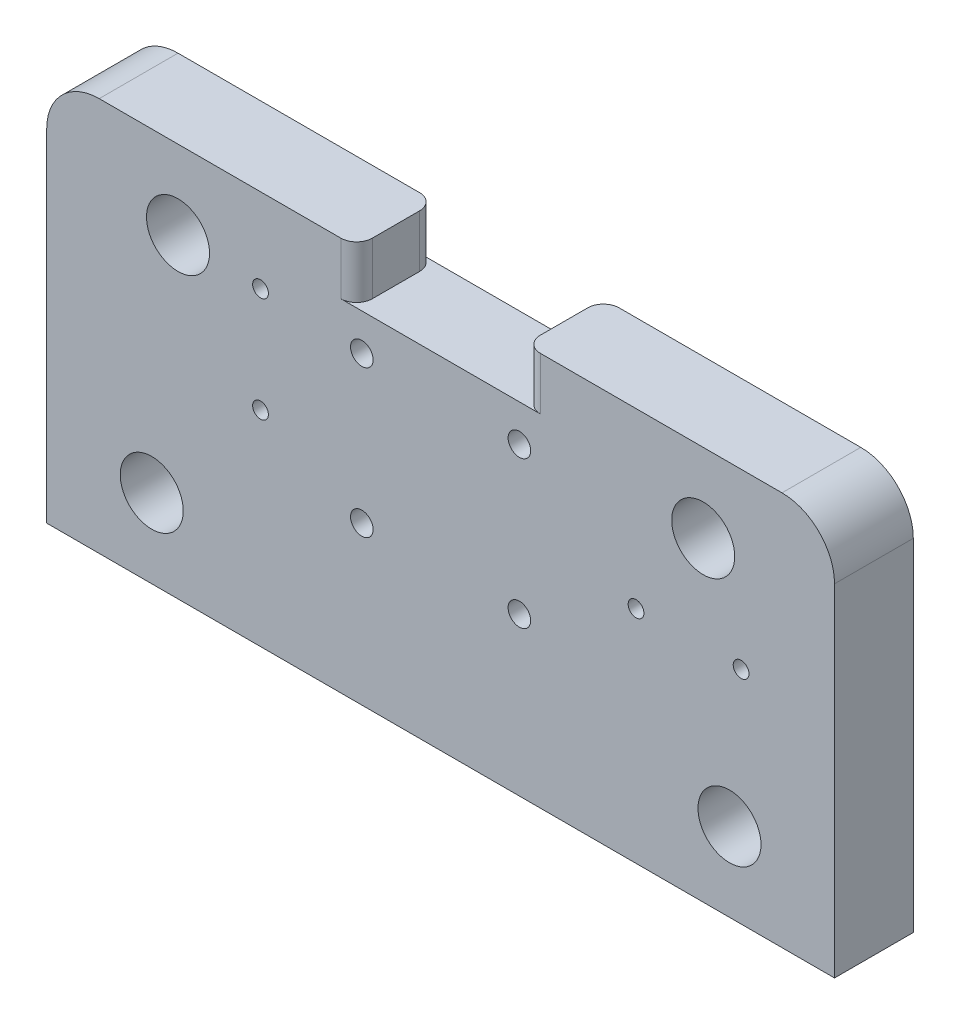
ISO-10303-21;
HEADER;
FILE_DESCRIPTION(('STEP AP214'),'2;1');
FILE_NAME('part.step','',(''),(''),'','','');
FILE_SCHEMA(('AUTOMOTIVE_DESIGN { 1 0 10303 214 1 1 1 1 }'));
ENDSEC;
DATA;
#1=APPLICATION_CONTEXT('core data for automotive mechanical design processes');
#2=APPLICATION_PROTOCOL_DEFINITION('international standard','automotive_design',2000,#1);
#3=PRODUCT_CONTEXT('',#1,'mechanical');
#4=PRODUCT('Part','Part','',(#3));
#5=PRODUCT_RELATED_PRODUCT_CATEGORY('part','',(#4));
#6=PRODUCT_DEFINITION_FORMATION('','',#4);
#7=PRODUCT_DEFINITION_CONTEXT('part definition',#1,'design');
#8=PRODUCT_DEFINITION('design','',#6,#7);
#9=PRODUCT_DEFINITION_SHAPE('','',#8);
#10=(LENGTH_UNIT() NAMED_UNIT(*) SI_UNIT(.MILLI.,.METRE.));
#11=(NAMED_UNIT(*) PLANE_ANGLE_UNIT() SI_UNIT($,.RADIAN.));
#12=(NAMED_UNIT(*) SI_UNIT($,.STERADIAN.) SOLID_ANGLE_UNIT());
#13=UNCERTAINTY_MEASURE_WITH_UNIT(LENGTH_MEASURE(1.E-05),#10,'distance_accuracy_value','');
#14=(GEOMETRIC_REPRESENTATION_CONTEXT(3) GLOBAL_UNCERTAINTY_ASSIGNED_CONTEXT((#13)) GLOBAL_UNIT_ASSIGNED_CONTEXT((#10,
#11,#12)) REPRESENTATION_CONTEXT('',''));
#15=CARTESIAN_POINT('',(0.,0.,0.));
#16=DIRECTION('',(0.,0.,1.));
#17=DIRECTION('',(1.,0.,0.));
#18=AXIS2_PLACEMENT_3D('',#15,#16,#17);
#19=CARTESIAN_POINT('',(-65.,27.5,15.));
#20=DIRECTION('',(0.,0.,-1.));
#21=DIRECTION('',(-1.,0.,0.));
#22=AXIS2_PLACEMENT_3D('',#19,#20,#21);
#23=PLANE('',#22);
#24=CARTESIAN_POINT('',(37.21,4.5,15.));
#25=DIRECTION('',(0.,0.,1.));
#26=DIRECTION('',(1.,0.,0.));
#27=AXIS2_PLACEMENT_3D('',#24,#25,#26);
#28=CIRCLE('',#27,1.5);
#29=CARTESIAN_POINT('',(38.71,4.5,15.));
#30=VERTEX_POINT('',#29);
#31=EDGE_CURVE('E679',#30,#30,#28,.T.);
#32=ORIENTED_EDGE('',*,*,#31,.F.);
#33=EDGE_LOOP('',(#32));
#34=FACE_BOUND('',#33,.T.);
#35=CARTESIAN_POINT('',(57.21,4.5,15.));
#36=DIRECTION('',(0.,0.,1.));
#37=DIRECTION('',(1.,0.,0.));
#38=AXIS2_PLACEMENT_3D('',#35,#36,#37);
#39=CIRCLE('',#38,1.5);
#40=CARTESIAN_POINT('',(58.71,4.5,15.));
#41=VERTEX_POINT('',#40);
#42=EDGE_CURVE('E676',#41,#41,#39,.T.);
#43=ORIENTED_EDGE('',*,*,#42,.F.);
#44=EDGE_LOOP('',(#43));
#45=FACE_BOUND('',#44,.T.);
#46=CARTESIAN_POINT('',(-34.29,1.50000000000002,15.));
#47=DIRECTION('',(0.,0.,1.));
#48=DIRECTION('',(1.,0.,0.));
#49=AXIS2_PLACEMENT_3D('',#46,#47,#48);
#50=CIRCLE('',#49,1.5);
#51=CARTESIAN_POINT('',(-32.79,1.50000000000002,15.));
#52=VERTEX_POINT('',#51);
#53=EDGE_CURVE('E668',#52,#52,#50,.T.);
#54=ORIENTED_EDGE('',*,*,#53,.F.);
#55=EDGE_LOOP('',(#54));
#56=FACE_BOUND('',#55,.T.);
#57=CARTESIAN_POINT('',(-34.29,21.5,15.));
#58=DIRECTION('',(0.,0.,1.));
#59=DIRECTION('',(1.,0.,0.));
#60=AXIS2_PLACEMENT_3D('',#57,#58,#59);
#61=CIRCLE('',#60,1.5);
#62=CARTESIAN_POINT('',(-32.79,21.5,15.));
#63=VERTEX_POINT('',#62);
#64=EDGE_CURVE('E661',#63,#63,#61,.T.);
#65=ORIENTED_EDGE('',*,*,#64,.F.);
#66=EDGE_LOOP('',(#65));
#67=FACE_BOUND('',#66,.T.);
#68=CARTESIAN_POINT('',(50.,22.5,15.));
#69=DIRECTION('',(0.,0.,1.));
#70=DIRECTION('',(1.,0.,0.));
#71=AXIS2_PLACEMENT_3D('',#68,#69,#70);
#72=CIRCLE('',#71,6.);
#73=CARTESIAN_POINT('',(56.,22.5,15.));
#74=VERTEX_POINT('',#73);
#75=EDGE_CURVE('E650',#74,#74,#72,.T.);
#76=ORIENTED_EDGE('',*,*,#75,.F.);
#77=EDGE_LOOP('',(#76));
#78=FACE_BOUND('',#77,.T.);
#79=CARTESIAN_POINT('',(-55.,-22.5,15.));
#80=DIRECTION('',(0.,0.,1.));
#81=DIRECTION('',(1.,0.,0.));
#82=AXIS2_PLACEMENT_3D('',#79,#80,#81);
#83=CIRCLE('',#82,5.99999999999999);
#84=CARTESIAN_POINT('',(-49.,-22.5,15.));
#85=VERTEX_POINT('',#84);
#86=EDGE_CURVE('E643',#85,#85,#83,.T.);
#87=ORIENTED_EDGE('',*,*,#86,.F.);
#88=EDGE_LOOP('',(#87));
#89=FACE_BOUND('',#88,.T.);
#90=CARTESIAN_POINT('',(55.,-22.5,15.));
#91=DIRECTION('',(0.,0.,1.));
#92=DIRECTION('',(1.,0.,0.));
#93=AXIS2_PLACEMENT_3D('',#90,#91,#92);
#94=CIRCLE('',#93,5.99999999999999);
#95=CARTESIAN_POINT('',(61.,-22.5,15.));
#96=VERTEX_POINT('',#95);
#97=EDGE_CURVE('E655',#96,#96,#94,.T.);
#98=ORIENTED_EDGE('',*,*,#97,.F.);
#99=EDGE_LOOP('',(#98));
#100=FACE_BOUND('',#99,.T.);
#101=CARTESIAN_POINT('',(-50.,22.5,15.));
#102=DIRECTION('',(0.,0.,1.));
#103=DIRECTION('',(1.,0.,0.));
#104=AXIS2_PLACEMENT_3D('',#101,#102,#103);
#105=CIRCLE('',#104,6.);
#106=CARTESIAN_POINT('',(-44.,22.5,15.));
#107=VERTEX_POINT('',#106);
#108=EDGE_CURVE('E637',#107,#107,#105,.T.);
#109=ORIENTED_EDGE('',*,*,#108,.F.);
#110=EDGE_LOOP('',(#109));
#111=FACE_BOUND('',#110,.T.);
#112=DIRECTION('',(1.,0.,0.));
#113=VECTOR('',#112,1.);
#114=CARTESIAN_POINT('',(16.,37.5,15.));
#115=LINE('',#114,#113);
#116=CARTESIAN_POINT('',(18.9999999999999,37.5,15.));
#117=VERTEX_POINT('',#116);
#118=CARTESIAN_POINT('',(65.,37.5,15.));
#119=VERTEX_POINT('',#118);
#120=EDGE_CURVE('E304',#117,#119,#115,.T.);
#121=ORIENTED_EDGE('',*,*,#120,.F.);
#122=DIRECTION('',(0.,-1.,0.));
#123=VECTOR('',#122,1.);
#124=CARTESIAN_POINT('',(18.9999999999999,27.5,15.));
#125=LINE('',#124,#123);
#126=CARTESIAN_POINT('',(18.9999999999999,27.5,15.));
#127=VERTEX_POINT('',#126);
#128=EDGE_CURVE('E366',#117,#127,#125,.T.);
#129=ORIENTED_EDGE('',*,*,#128,.T.);
#130=DIRECTION('',(1.,0.,0.));
#131=VECTOR('',#130,1.);
#132=CARTESIAN_POINT('',(-16.,27.5,15.));
#133=LINE('',#132,#131);
#134=CARTESIAN_POINT('',(-19.,27.5,15.));
#135=VERTEX_POINT('',#134);
#136=EDGE_CURVE('E290',#135,#127,#133,.T.);
#137=ORIENTED_EDGE('',*,*,#136,.F.);
#138=DIRECTION('',(0.,-1.,0.));
#139=VECTOR('',#138,1.);
#140=CARTESIAN_POINT('',(-19.,37.5,15.));
#141=LINE('',#140,#139);
#142=CARTESIAN_POINT('',(-19.,37.5,15.));
#143=VERTEX_POINT('',#142);
#144=EDGE_CURVE('E289',#135,#143,#141,.F.);
#145=ORIENTED_EDGE('',*,*,#144,.T.);
#146=DIRECTION('',(1.,0.,0.));
#147=VECTOR('',#146,1.);
#148=CARTESIAN_POINT('',(-65.,37.5,15.));
#149=LINE('',#148,#147);
#150=CARTESIAN_POINT('',(-65.,37.5,15.));
#151=VERTEX_POINT('',#150);
#152=EDGE_CURVE('E273',#151,#143,#149,.T.);
#153=ORIENTED_EDGE('',*,*,#152,.F.);
#154=CARTESIAN_POINT('',(-65.,27.5,15.));
#155=DIRECTION('',(0.,0.,-1.));
#156=DIRECTION('',(-1.,0.,0.));
#157=AXIS2_PLACEMENT_3D('',#154,#155,#156);
#158=CIRCLE('',#157,10.);
#159=CARTESIAN_POINT('',(-75.,27.5,15.));
#160=VERTEX_POINT('',#159);
#161=EDGE_CURVE('E288',#160,#151,#158,.T.);
#162=ORIENTED_EDGE('',*,*,#161,.F.);
#163=DIRECTION('',(0.,-1.,0.));
#164=VECTOR('',#163,1.);
#165=CARTESIAN_POINT('',(-75.,27.5,15.));
#166=LINE('',#165,#164);
#167=CARTESIAN_POINT('',(-75.,-37.5,15.));
#168=VERTEX_POINT('',#167);
#169=EDGE_CURVE('E282',#160,#168,#166,.T.);
#170=ORIENTED_EDGE('',*,*,#169,.T.);
#171=DIRECTION('',(1.,0.,0.));
#172=VECTOR('',#171,1.);
#173=CARTESIAN_POINT('',(-75.,-37.5,15.));
#174=LINE('',#173,#172);
#175=CARTESIAN_POINT('',(75.,-37.5,15.));
#176=VERTEX_POINT('',#175);
#177=EDGE_CURVE('E312',#168,#176,#174,.T.);
#178=ORIENTED_EDGE('',*,*,#177,.T.);
#179=DIRECTION('',(0.,-1.,0.));
#180=VECTOR('',#179,1.);
#181=CARTESIAN_POINT('',(75.,27.5,15.));
#182=LINE('',#181,#180);
#183=CARTESIAN_POINT('',(75.,27.5,15.));
#184=VERTEX_POINT('',#183);
#185=EDGE_CURVE('E309',#184,#176,#182,.T.);
#186=ORIENTED_EDGE('',*,*,#185,.F.);
#187=CARTESIAN_POINT('',(65.,27.5,15.));
#188=DIRECTION('',(0.,0.,1.));
#189=DIRECTION('',(1.,0.,0.));
#190=AXIS2_PLACEMENT_3D('',#187,#188,#189);
#191=CIRCLE('',#190,10.);
#192=EDGE_CURVE('E306',#184,#119,#191,.T.);
#193=ORIENTED_EDGE('',*,*,#192,.T.);
#194=EDGE_LOOP('',(#121,#129,#137,#145,#153,#162,#170,#178,#186,#193));
#195=FACE_BOUND('',#194,.T.);
#196=CARTESIAN_POINT('',(-15.,20.5,15.));
#197=DIRECTION('',(0.,0.,1.));
#198=DIRECTION('',(1.,0.,0.));
#199=AXIS2_PLACEMENT_3D('',#196,#197,#198);
#200=CIRCLE('',#199,2.15);
#201=CARTESIAN_POINT('',(-12.85,20.5,15.));
#202=VERTEX_POINT('',#201);
#203=EDGE_CURVE('E317',#202,#202,#200,.T.);
#204=ORIENTED_EDGE('',*,*,#203,.F.);
#205=EDGE_LOOP('',(#204));
#206=FACE_BOUND('',#205,.T.);
#207=CARTESIAN_POINT('',(15.,20.5,15.));
#208=DIRECTION('',(0.,0.,1.));
#209=DIRECTION('',(1.,0.,0.));
#210=AXIS2_PLACEMENT_3D('',#207,#208,#209);
#211=CIRCLE('',#210,2.15);
#212=CARTESIAN_POINT('',(17.15,20.5,15.));
#213=VERTEX_POINT('',#212);
#214=EDGE_CURVE('E606',#213,#213,#211,.T.);
#215=ORIENTED_EDGE('',*,*,#214,.F.);
#216=EDGE_LOOP('',(#215));
#217=FACE_BOUND('',#216,.T.);
#218=CARTESIAN_POINT('',(15.,-7.5,15.));
#219=DIRECTION('',(0.,0.,1.));
#220=DIRECTION('',(1.,0.,0.));
#221=AXIS2_PLACEMENT_3D('',#218,#219,#220);
#222=CIRCLE('',#221,2.15);
#223=CARTESIAN_POINT('',(17.15,-7.5,15.));
#224=VERTEX_POINT('',#223);
#225=EDGE_CURVE('E610',#224,#224,#222,.T.);
#226=ORIENTED_EDGE('',*,*,#225,.F.);
#227=EDGE_LOOP('',(#226));
#228=FACE_BOUND('',#227,.T.);
#229=CARTESIAN_POINT('',(-15.,-7.5,15.));
#230=DIRECTION('',(0.,0.,1.));
#231=DIRECTION('',(1.,0.,0.));
#232=AXIS2_PLACEMENT_3D('',#229,#230,#231);
#233=CIRCLE('',#232,2.15);
#234=CARTESIAN_POINT('',(-12.85,-7.5,15.));
#235=VERTEX_POINT('',#234);
#236=EDGE_CURVE('E629',#235,#235,#233,.T.);
#237=ORIENTED_EDGE('',*,*,#236,.F.);
#238=EDGE_LOOP('',(#237));
#239=FACE_BOUND('',#238,.T.);
#240=ADVANCED_FACE('F168',(#34,#45,#56,#67,#78,#89,#100,#111,#195,#206,#217,#228,#239),#23,.F.);
#241=CARTESIAN_POINT('',(-65.,27.5,0.));
#242=DIRECTION('',(0.,0.,-1.));
#243=DIRECTION('',(-1.,0.,0.));
#244=AXIS2_PLACEMENT_3D('',#241,#242,#243);
#245=PLANE('',#244);
#246=CARTESIAN_POINT('',(37.21,4.5,0.));
#247=DIRECTION('',(0.,0.,1.));
#248=DIRECTION('',(1.,0.,0.));
#249=AXIS2_PLACEMENT_3D('',#246,#247,#248);
#250=CIRCLE('',#249,1.5);
#251=CARTESIAN_POINT('',(38.71,4.5,0.));
#252=VERTEX_POINT('',#251);
#253=EDGE_CURVE('E665',#252,#252,#250,.T.);
#254=ORIENTED_EDGE('',*,*,#253,.T.);
#255=EDGE_LOOP('',(#254));
#256=FACE_BOUND('',#255,.T.);
#257=CARTESIAN_POINT('',(57.21,4.5,0.));
#258=DIRECTION('',(0.,0.,1.));
#259=DIRECTION('',(1.,0.,0.));
#260=AXIS2_PLACEMENT_3D('',#257,#258,#259);
#261=CIRCLE('',#260,1.5);
#262=CARTESIAN_POINT('',(58.71,4.5,0.));
#263=VERTEX_POINT('',#262);
#264=EDGE_CURVE('E673',#263,#263,#261,.T.);
#265=ORIENTED_EDGE('',*,*,#264,.T.);
#266=EDGE_LOOP('',(#265));
#267=FACE_BOUND('',#266,.T.);
#268=CARTESIAN_POINT('',(-34.29,1.50000000000002,0.));
#269=DIRECTION('',(0.,0.,1.));
#270=DIRECTION('',(1.,0.,0.));
#271=AXIS2_PLACEMENT_3D('',#268,#269,#270);
#272=CIRCLE('',#271,1.5);
#273=CARTESIAN_POINT('',(-32.79,1.50000000000002,0.));
#274=VERTEX_POINT('',#273);
#275=EDGE_CURVE('E658',#274,#274,#272,.T.);
#276=ORIENTED_EDGE('',*,*,#275,.T.);
#277=EDGE_LOOP('',(#276));
#278=FACE_BOUND('',#277,.T.);
#279=CARTESIAN_POINT('',(-34.29,21.5,0.));
#280=DIRECTION('',(0.,0.,1.));
#281=DIRECTION('',(1.,0.,0.));
#282=AXIS2_PLACEMENT_3D('',#279,#280,#281);
#283=CIRCLE('',#282,1.5);
#284=CARTESIAN_POINT('',(-32.79,21.5,0.));
#285=VERTEX_POINT('',#284);
#286=EDGE_CURVE('E664',#285,#285,#283,.T.);
#287=ORIENTED_EDGE('',*,*,#286,.T.);
#288=EDGE_LOOP('',(#287));
#289=FACE_BOUND('',#288,.T.);
#290=CARTESIAN_POINT('',(50.,22.5,0.));
#291=DIRECTION('',(0.,0.,1.));
#292=DIRECTION('',(1.,0.,0.));
#293=AXIS2_PLACEMENT_3D('',#290,#291,#292);
#294=CIRCLE('',#293,6.);
#295=CARTESIAN_POINT('',(56.,22.5,0.));
#296=VERTEX_POINT('',#295);
#297=EDGE_CURVE('E640',#296,#296,#294,.T.);
#298=ORIENTED_EDGE('',*,*,#297,.T.);
#299=EDGE_LOOP('',(#298));
#300=FACE_BOUND('',#299,.T.);
#301=CARTESIAN_POINT('',(-55.,-22.5,0.));
#302=DIRECTION('',(0.,0.,1.));
#303=DIRECTION('',(1.,0.,0.));
#304=AXIS2_PLACEMENT_3D('',#301,#302,#303);
#305=CIRCLE('',#304,5.99999999999999);
#306=CARTESIAN_POINT('',(-49.,-22.5,0.));
#307=VERTEX_POINT('',#306);
#308=EDGE_CURVE('E646',#307,#307,#305,.T.);
#309=ORIENTED_EDGE('',*,*,#308,.T.);
#310=EDGE_LOOP('',(#309));
#311=FACE_BOUND('',#310,.T.);
#312=CARTESIAN_POINT('',(55.,-22.5,0.));
#313=DIRECTION('',(0.,0.,1.));
#314=DIRECTION('',(1.,0.,0.));
#315=AXIS2_PLACEMENT_3D('',#312,#313,#314);
#316=CIRCLE('',#315,5.99999999999999);
#317=CARTESIAN_POINT('',(61.,-22.5,0.));
#318=VERTEX_POINT('',#317);
#319=EDGE_CURVE('E647',#318,#318,#316,.T.);
#320=ORIENTED_EDGE('',*,*,#319,.T.);
#321=EDGE_LOOP('',(#320));
#322=FACE_BOUND('',#321,.T.);
#323=CARTESIAN_POINT('',(-50.,22.5,0.));
#324=DIRECTION('',(0.,0.,1.));
#325=DIRECTION('',(1.,0.,0.));
#326=AXIS2_PLACEMENT_3D('',#323,#324,#325);
#327=CIRCLE('',#326,6.);
#328=CARTESIAN_POINT('',(-44.,22.5,0.));
#329=VERTEX_POINT('',#328);
#330=EDGE_CURVE('E634',#329,#329,#327,.T.);
#331=ORIENTED_EDGE('',*,*,#330,.T.);
#332=EDGE_LOOP('',(#331));
#333=FACE_BOUND('',#332,.T.);
#334=CARTESIAN_POINT('',(15.,-7.5,0.));
#335=DIRECTION('',(0.,0.,1.));
#336=DIRECTION('',(1.,0.,0.));
#337=AXIS2_PLACEMENT_3D('',#334,#335,#336);
#338=CIRCLE('',#337,2.15);
#339=CARTESIAN_POINT('',(17.15,-7.5,0.));
#340=VERTEX_POINT('',#339);
#341=EDGE_CURVE('E614',#340,#340,#338,.T.);
#342=ORIENTED_EDGE('',*,*,#341,.T.);
#343=EDGE_LOOP('',(#342));
#344=FACE_BOUND('',#343,.T.);
#345=CARTESIAN_POINT('',(-15.,20.5,0.));
#346=DIRECTION('',(0.,0.,1.));
#347=DIRECTION('',(1.,0.,0.));
#348=AXIS2_PLACEMENT_3D('',#345,#346,#347);
#349=CIRCLE('',#348,2.15);
#350=CARTESIAN_POINT('',(-12.85,20.5,0.));
#351=VERTEX_POINT('',#350);
#352=EDGE_CURVE('E300',#351,#351,#349,.T.);
#353=ORIENTED_EDGE('',*,*,#352,.T.);
#354=EDGE_LOOP('',(#353));
#355=FACE_BOUND('',#354,.T.);
#356=DIRECTION('',(1.,0.,0.));
#357=VECTOR('',#356,1.);
#358=CARTESIAN_POINT('',(-16.,27.5,0.));
#359=LINE('',#358,#357);
#360=CARTESIAN_POINT('',(-19.,27.5,0.));
#361=VERTEX_POINT('',#360);
#362=CARTESIAN_POINT('',(19.,27.5,0.));
#363=VERTEX_POINT('',#362);
#364=EDGE_CURVE('E319',#361,#363,#359,.T.);
#365=ORIENTED_EDGE('',*,*,#364,.T.);
#366=DIRECTION('',(0.,-1.,0.));
#367=VECTOR('',#366,1.);
#368=CARTESIAN_POINT('',(19.,37.5,0.));
#369=LINE('',#368,#367);
#370=CARTESIAN_POINT('',(19.,37.5,0.));
#371=VERTEX_POINT('',#370);
#372=EDGE_CURVE('E359',#363,#371,#369,.F.);
#373=ORIENTED_EDGE('',*,*,#372,.T.);
#374=DIRECTION('',(1.,0.,0.));
#375=VECTOR('',#374,1.);
#376=CARTESIAN_POINT('',(16.,37.5,0.));
#377=LINE('',#376,#375);
#378=CARTESIAN_POINT('',(65.,37.5,0.));
#379=VERTEX_POINT('',#378);
#380=EDGE_CURVE('E321',#371,#379,#377,.T.);
#381=ORIENTED_EDGE('',*,*,#380,.T.);
#382=CARTESIAN_POINT('',(65.,27.5,0.));
#383=DIRECTION('',(0.,0.,1.));
#384=DIRECTION('',(1.,0.,0.));
#385=AXIS2_PLACEMENT_3D('',#382,#383,#384);
#386=CIRCLE('',#385,10.);
#387=CARTESIAN_POINT('',(75.,27.5,0.));
#388=VERTEX_POINT('',#387);
#389=EDGE_CURVE('E323',#388,#379,#386,.T.);
#390=ORIENTED_EDGE('',*,*,#389,.F.);
#391=DIRECTION('',(0.,-1.,0.));
#392=VECTOR('',#391,1.);
#393=CARTESIAN_POINT('',(75.,27.5,0.));
#394=LINE('',#393,#392);
#395=CARTESIAN_POINT('',(75.,-37.5,0.));
#396=VERTEX_POINT('',#395);
#397=EDGE_CURVE('E326',#388,#396,#394,.T.);
#398=ORIENTED_EDGE('',*,*,#397,.T.);
#399=DIRECTION('',(1.,0.,0.));
#400=VECTOR('',#399,1.);
#401=CARTESIAN_POINT('',(-75.,-37.5,0.));
#402=LINE('',#401,#400);
#403=CARTESIAN_POINT('',(-75.,-37.5,0.));
#404=VERTEX_POINT('',#403);
#405=EDGE_CURVE('E297',#404,#396,#402,.T.);
#406=ORIENTED_EDGE('',*,*,#405,.F.);
#407=DIRECTION('',(0.,-1.,0.));
#408=VECTOR('',#407,1.);
#409=CARTESIAN_POINT('',(-75.,27.5,0.));
#410=LINE('',#409,#408);
#411=CARTESIAN_POINT('',(-75.,27.5,0.));
#412=VERTEX_POINT('',#411);
#413=EDGE_CURVE('E295',#412,#404,#410,.T.);
#414=ORIENTED_EDGE('',*,*,#413,.F.);
#415=CARTESIAN_POINT('',(-65.,27.5,0.));
#416=DIRECTION('',(0.,0.,-1.));
#417=DIRECTION('',(-1.,0.,0.));
#418=AXIS2_PLACEMENT_3D('',#415,#416,#417);
#419=CIRCLE('',#418,10.);
#420=CARTESIAN_POINT('',(-65.,37.5,0.));
#421=VERTEX_POINT('',#420);
#422=EDGE_CURVE('E315',#412,#421,#419,.T.);
#423=ORIENTED_EDGE('',*,*,#422,.T.);
#424=DIRECTION('',(1.,0.,0.));
#425=VECTOR('',#424,1.);
#426=CARTESIAN_POINT('',(-65.,37.5,0.));
#427=LINE('',#426,#425);
#428=CARTESIAN_POINT('',(-19.,37.5,0.));
#429=VERTEX_POINT('',#428);
#430=EDGE_CURVE('E276',#421,#429,#427,.T.);
#431=ORIENTED_EDGE('',*,*,#430,.T.);
#432=DIRECTION('',(0.,-1.,0.));
#433=VECTOR('',#432,1.);
#434=CARTESIAN_POINT('',(-19.,27.5,0.));
#435=LINE('',#434,#433);
#436=EDGE_CURVE('E356',#429,#361,#435,.T.);
#437=ORIENTED_EDGE('',*,*,#436,.T.);
#438=EDGE_LOOP('',(#365,#373,#381,#390,#398,#406,#414,#423,#431,#437));
#439=FACE_BOUND('',#438,.T.);
#440=CARTESIAN_POINT('',(15.,20.5,0.));
#441=DIRECTION('',(0.,0.,1.));
#442=DIRECTION('',(1.,0.,0.));
#443=AXIS2_PLACEMENT_3D('',#440,#441,#442);
#444=CIRCLE('',#443,2.15);
#445=CARTESIAN_POINT('',(17.15,20.5,0.));
#446=VERTEX_POINT('',#445);
#447=EDGE_CURVE('E609',#446,#446,#444,.T.);
#448=ORIENTED_EDGE('',*,*,#447,.T.);
#449=EDGE_LOOP('',(#448));
#450=FACE_BOUND('',#449,.T.);
#451=CARTESIAN_POINT('',(-15.,-7.5,0.));
#452=DIRECTION('',(0.,0.,1.));
#453=DIRECTION('',(1.,0.,0.));
#454=AXIS2_PLACEMENT_3D('',#451,#452,#453);
#455=CIRCLE('',#454,2.15);
#456=CARTESIAN_POINT('',(-12.85,-7.5,0.));
#457=VERTEX_POINT('',#456);
#458=EDGE_CURVE('E630',#457,#457,#455,.T.);
#459=ORIENTED_EDGE('',*,*,#458,.T.);
#460=EDGE_LOOP('',(#459));
#461=FACE_BOUND('',#460,.T.);
#462=ADVANCED_FACE('F412',(#256,#267,#278,#289,#300,#311,#322,#333,#344,#355,#439,#450,#461),
#245,.T.);
#463=CARTESIAN_POINT('',(-65.,27.5,15.));
#464=DIRECTION('',(0.,0.,-1.));
#465=DIRECTION('',(-1.,0.,0.));
#466=AXIS2_PLACEMENT_3D('',#463,#464,#465);
#467=CYLINDRICAL_SURFACE('',#466,10.);
#468=ORIENTED_EDGE('',*,*,#422,.F.);
#469=DIRECTION('',(0.,0.,-1.));
#470=VECTOR('',#469,1.);
#471=CARTESIAN_POINT('',(-75.,27.5,15.));
#472=LINE('',#471,#470);
#473=EDGE_CURVE('E293',#160,#412,#472,.T.);
#474=ORIENTED_EDGE('',*,*,#473,.F.);
#475=ORIENTED_EDGE('',*,*,#161,.T.);
#476=DIRECTION('',(0.,0.,-1.));
#477=VECTOR('',#476,1.);
#478=CARTESIAN_POINT('',(-65.,37.5,15.));
#479=LINE('',#478,#477);
#480=EDGE_CURVE('E269',#151,#421,#479,.T.);
#481=ORIENTED_EDGE('',*,*,#480,.T.);
#482=EDGE_LOOP('',(#468,#474,#475,#481));
#483=FACE_BOUND('',#482,.T.);
#484=ADVANCED_FACE('F292',(#483),#467,.T.);
#485=CARTESIAN_POINT('',(-75.,27.5,15.));
#486=DIRECTION('',(1.,0.,0.));
#487=DIRECTION('',(0.,1.,0.));
#488=AXIS2_PLACEMENT_3D('',#485,#486,#487);
#489=PLANE('',#488);
#490=ORIENTED_EDGE('',*,*,#413,.T.);
#491=DIRECTION('',(0.,0.,-1.));
#492=VECTOR('',#491,1.);
#493=CARTESIAN_POINT('',(-75.,-37.5,15.));
#494=LINE('',#493,#492);
#495=EDGE_CURVE('E333',#168,#404,#494,.T.);
#496=ORIENTED_EDGE('',*,*,#495,.F.);
#497=ORIENTED_EDGE('',*,*,#169,.F.);
#498=ORIENTED_EDGE('',*,*,#473,.T.);
#499=EDGE_LOOP('',(#490,#496,#497,#498));
#500=FACE_BOUND('',#499,.T.);
#501=ADVANCED_FACE('F418',(#500),#489,.F.);
#502=CARTESIAN_POINT('',(-75.,-37.5,15.));
#503=DIRECTION('',(0.,1.,0.));
#504=DIRECTION('',(0.,0.,1.));
#505=AXIS2_PLACEMENT_3D('',#502,#503,#504);
#506=PLANE('',#505);
#507=ORIENTED_EDGE('',*,*,#405,.T.);
#508=DIRECTION('',(0.,0.,-1.));
#509=VECTOR('',#508,1.);
#510=CARTESIAN_POINT('',(75.,-37.5,15.));
#511=LINE('',#510,#509);
#512=EDGE_CURVE('E336',#176,#396,#511,.T.);
#513=ORIENTED_EDGE('',*,*,#512,.F.);
#514=ORIENTED_EDGE('',*,*,#177,.F.);
#515=ORIENTED_EDGE('',*,*,#495,.T.);
#516=EDGE_LOOP('',(#507,#513,#514,#515));
#517=FACE_BOUND('',#516,.T.);
#518=ADVANCED_FACE('F421',(#517),#506,.F.);
#519=CARTESIAN_POINT('',(75.,27.5,15.));
#520=DIRECTION('',(1.,0.,0.));
#521=DIRECTION('',(0.,1.,0.));
#522=AXIS2_PLACEMENT_3D('',#519,#520,#521);
#523=PLANE('',#522);
#524=ORIENTED_EDGE('',*,*,#397,.F.);
#525=DIRECTION('',(0.,0.,-1.));
#526=VECTOR('',#525,1.);
#527=CARTESIAN_POINT('',(75.,27.5,15.));
#528=LINE('',#527,#526);
#529=EDGE_CURVE('E338',#184,#388,#528,.T.);
#530=ORIENTED_EDGE('',*,*,#529,.F.);
#531=ORIENTED_EDGE('',*,*,#185,.T.);
#532=ORIENTED_EDGE('',*,*,#512,.T.);
#533=EDGE_LOOP('',(#524,#530,#531,#532));
#534=FACE_BOUND('',#533,.T.);
#535=ADVANCED_FACE('F425',(#534),#523,.T.);
#536=CARTESIAN_POINT('',(65.,27.5,15.));
#537=DIRECTION('',(0.,0.,-1.));
#538=DIRECTION('',(-1.,0.,0.));
#539=AXIS2_PLACEMENT_3D('',#536,#537,#538);
#540=CYLINDRICAL_SURFACE('',#539,10.);
#541=ORIENTED_EDGE('',*,*,#389,.T.);
#542=DIRECTION('',(0.,0.,-1.));
#543=VECTOR('',#542,1.);
#544=CARTESIAN_POINT('',(65.,37.5,15.));
#545=LINE('',#544,#543);
#546=EDGE_CURVE('E340',#119,#379,#545,.T.);
#547=ORIENTED_EDGE('',*,*,#546,.F.);
#548=ORIENTED_EDGE('',*,*,#192,.F.);
#549=ORIENTED_EDGE('',*,*,#529,.T.);
#550=EDGE_LOOP('',(#541,#547,#548,#549));
#551=FACE_BOUND('',#550,.T.);
#552=ADVANCED_FACE('F400',(#551),#540,.T.);
#553=CARTESIAN_POINT('',(16.,37.5,15.));
#554=DIRECTION('',(0.,1.,0.));
#555=DIRECTION('',(-1.,0.,0.));
#556=AXIS2_PLACEMENT_3D('',#553,#554,#555);
#557=PLANE('',#556);
#558=ORIENTED_EDGE('',*,*,#380,.F.);
#559=CARTESIAN_POINT('',(19.,37.5,3.));
#560=DIRECTION('',(0.,1.,0.));
#561=DIRECTION('',(-1.,0.,0.));
#562=AXIS2_PLACEMENT_3D('',#559,#560,#561);
#563=CIRCLE('',#562,3.);
#564=CARTESIAN_POINT('',(16.,37.5,3.));
#565=VERTEX_POINT('',#564);
#566=EDGE_CURVE('E363',#371,#565,#563,.T.);
#567=ORIENTED_EDGE('',*,*,#566,.T.);
#568=DIRECTION('',(0.,0.,-1.));
#569=VECTOR('',#568,1.);
#570=CARTESIAN_POINT('',(16.,37.5,15.));
#571=LINE('',#570,#569);
#572=CARTESIAN_POINT('',(16.,37.5,12.));
#573=VERTEX_POINT('',#572);
#574=EDGE_CURVE('E343',#573,#565,#571,.T.);
#575=ORIENTED_EDGE('',*,*,#574,.F.);
#576=CARTESIAN_POINT('',(18.9999999999999,37.5,12.));
#577=DIRECTION('',(0.,1.,0.));
#578=DIRECTION('',(-1.,0.,0.));
#579=AXIS2_PLACEMENT_3D('',#576,#577,#578);
#580=CIRCLE('',#579,3.);
#581=EDGE_CURVE('E361',#573,#117,#580,.T.);
#582=ORIENTED_EDGE('',*,*,#581,.T.);
#583=ORIENTED_EDGE('',*,*,#120,.T.);
#584=ORIENTED_EDGE('',*,*,#546,.T.);
#585=EDGE_LOOP('',(#558,#567,#575,#582,#583,#584));
#586=FACE_BOUND('',#585,.T.);
#587=ADVANCED_FACE('F395',(#586),#557,.T.);
#588=CARTESIAN_POINT('',(16.,37.5,15.));
#589=DIRECTION('',(1.,0.,0.));
#590=DIRECTION('',(0.,0.,-1.));
#591=AXIS2_PLACEMENT_3D('',#588,#589,#590);
#592=PLANE('',#591);
#593=ORIENTED_EDGE('',*,*,#574,.T.);
#594=DIRECTION('',(0.,-1.,0.));
#595=VECTOR('',#594,1.);
#596=CARTESIAN_POINT('',(16.,27.5,3.));
#597=LINE('',#596,#595);
#598=CARTESIAN_POINT('',(16.,27.5,3.));
#599=VERTEX_POINT('',#598);
#600=EDGE_CURVE('E353',#565,#599,#597,.T.);
#601=ORIENTED_EDGE('',*,*,#600,.T.);
#602=DIRECTION('',(0.,0.,-1.));
#603=VECTOR('',#602,1.);
#604=CARTESIAN_POINT('',(16.,27.5,15.));
#605=LINE('',#604,#603);
#606=CARTESIAN_POINT('',(16.,27.5,12.));
#607=VERTEX_POINT('',#606);
#608=EDGE_CURVE('E346',#607,#599,#605,.T.);
#609=ORIENTED_EDGE('',*,*,#608,.F.);
#610=DIRECTION('',(0.,-1.,0.));
#611=VECTOR('',#610,1.);
#612=CARTESIAN_POINT('',(16.,37.5,12.));
#613=LINE('',#612,#611);
#614=EDGE_CURVE('E332',#607,#573,#613,.F.);
#615=ORIENTED_EDGE('',*,*,#614,.T.);
#616=EDGE_LOOP('',(#593,#601,#609,#615));
#617=FACE_BOUND('',#616,.T.);
#618=ADVANCED_FACE('F388',(#617),#592,.F.);
#619=CARTESIAN_POINT('',(-16.,27.5,15.));
#620=DIRECTION('',(0.,1.,0.));
#621=DIRECTION('',(-1.,0.,0.));
#622=AXIS2_PLACEMENT_3D('',#619,#620,#621);
#623=PLANE('',#622);
#624=ORIENTED_EDGE('',*,*,#364,.F.);
#625=CARTESIAN_POINT('',(-19.,27.5,3.));
#626=DIRECTION('',(0.,1.,0.));
#627=DIRECTION('',(-1.,0.,0.));
#628=AXIS2_PLACEMENT_3D('',#625,#626,#627);
#629=CIRCLE('',#628,3.);
#630=CARTESIAN_POINT('',(-16.,27.5,3.));
#631=VERTEX_POINT('',#630);
#632=EDGE_CURVE('E176',#361,#631,#629,.F.);
#633=ORIENTED_EDGE('',*,*,#632,.T.);
#634=DIRECTION('',(0.,0.,-1.));
#635=VECTOR('',#634,1.);
#636=CARTESIAN_POINT('',(-16.,27.5,15.));
#637=LINE('',#636,#635);
#638=CARTESIAN_POINT('',(-16.,27.5,12.));
#639=VERTEX_POINT('',#638);
#640=EDGE_CURVE('E349',#639,#631,#637,.T.);
#641=ORIENTED_EDGE('',*,*,#640,.F.);
#642=CARTESIAN_POINT('',(-19.,27.5,12.));
#643=DIRECTION('',(0.,1.,0.));
#644=DIRECTION('',(-1.,0.,0.));
#645=AXIS2_PLACEMENT_3D('',#642,#643,#644);
#646=CIRCLE('',#645,3.);
#647=EDGE_CURVE('E12',#639,#135,#646,.F.);
#648=ORIENTED_EDGE('',*,*,#647,.T.);
#649=ORIENTED_EDGE('',*,*,#136,.T.);
#650=CARTESIAN_POINT('',(18.9999999999999,27.5,12.));
#651=DIRECTION('',(0.,1.,0.));
#652=DIRECTION('',(-1.,0.,0.));
#653=AXIS2_PLACEMENT_3D('',#650,#651,#652);
#654=CIRCLE('',#653,3.);
#655=EDGE_CURVE('E380',#127,#607,#654,.F.);
#656=ORIENTED_EDGE('',*,*,#655,.T.);
#657=ORIENTED_EDGE('',*,*,#608,.T.);
#658=CARTESIAN_POINT('',(19.,27.5,3.));
#659=DIRECTION('',(0.,1.,0.));
#660=DIRECTION('',(-1.,0.,0.));
#661=AXIS2_PLACEMENT_3D('',#658,#659,#660);
#662=CIRCLE('',#661,3.);
#663=EDGE_CURVE('E377',#599,#363,#662,.F.);
#664=ORIENTED_EDGE('',*,*,#663,.T.);
#665=EDGE_LOOP('',(#624,#633,#641,#648,#649,#656,#657,#664));
#666=FACE_BOUND('',#665,.T.);
#667=ADVANCED_FACE('F383',(#666),#623,.T.);
#668=CARTESIAN_POINT('',(-16.,37.5,15.));
#669=DIRECTION('',(1.,0.,0.));
#670=DIRECTION('',(0.,0.,-1.));
#671=AXIS2_PLACEMENT_3D('',#668,#669,#670);
#672=PLANE('',#671);
#673=ORIENTED_EDGE('',*,*,#640,.T.);
#674=DIRECTION('',(0.,-1.,0.));
#675=VECTOR('',#674,1.);
#676=CARTESIAN_POINT('',(-16.,37.5,3.));
#677=LINE('',#676,#675);
#678=CARTESIAN_POINT('',(-16.,37.5,3.));
#679=VERTEX_POINT('',#678);
#680=EDGE_CURVE('E371',#631,#679,#677,.F.);
#681=ORIENTED_EDGE('',*,*,#680,.T.);
#682=DIRECTION('',(0.,0.,-1.));
#683=VECTOR('',#682,1.);
#684=CARTESIAN_POINT('',(-16.,37.5,15.));
#685=LINE('',#684,#683);
#686=CARTESIAN_POINT('',(-16.,37.5,12.));
#687=VERTEX_POINT('',#686);
#688=EDGE_CURVE('E281',#687,#679,#685,.T.);
#689=ORIENTED_EDGE('',*,*,#688,.F.);
#690=DIRECTION('',(0.,-1.,0.));
#691=VECTOR('',#690,1.);
#692=CARTESIAN_POINT('',(-16.,27.5,12.));
#693=LINE('',#692,#691);
#694=EDGE_CURVE('E369',#687,#639,#693,.T.);
#695=ORIENTED_EDGE('',*,*,#694,.T.);
#696=EDGE_LOOP('',(#673,#681,#689,#695));
#697=FACE_BOUND('',#696,.T.);
#698=ADVANCED_FACE('F477',(#697),#672,.T.);
#699=CARTESIAN_POINT('',(-65.,37.5,15.));
#700=DIRECTION('',(0.,1.,0.));
#701=DIRECTION('',(-1.,0.,0.));
#702=AXIS2_PLACEMENT_3D('',#699,#700,#701);
#703=PLANE('',#702);
#704=ORIENTED_EDGE('',*,*,#688,.T.);
#705=CARTESIAN_POINT('',(-19.,37.5,3.));
#706=DIRECTION('',(0.,1.,0.));
#707=DIRECTION('',(-1.,0.,0.));
#708=AXIS2_PLACEMENT_3D('',#705,#706,#707);
#709=CIRCLE('',#708,3.);
#710=EDGE_CURVE('E375',#679,#429,#709,.T.);
#711=ORIENTED_EDGE('',*,*,#710,.T.);
#712=ORIENTED_EDGE('',*,*,#430,.F.);
#713=ORIENTED_EDGE('',*,*,#480,.F.);
#714=ORIENTED_EDGE('',*,*,#152,.T.);
#715=CARTESIAN_POINT('',(-19.,37.5,12.));
#716=DIRECTION('',(0.,1.,0.));
#717=DIRECTION('',(-1.,0.,0.));
#718=AXIS2_PLACEMENT_3D('',#715,#716,#717);
#719=CIRCLE('',#718,3.);
#720=EDGE_CURVE('E373',#143,#687,#719,.T.);
#721=ORIENTED_EDGE('',*,*,#720,.T.);
#722=EDGE_LOOP('',(#704,#711,#712,#713,#714,#721));
#723=FACE_BOUND('',#722,.T.);
#724=ADVANCED_FACE('F272',(#723),#703,.T.);
#725=CARTESIAN_POINT('',(-15.,20.5,15.));
#726=DIRECTION('',(0.,0.,-1.));
#727=DIRECTION('',(-1.,0.,0.));
#728=AXIS2_PLACEMENT_3D('',#725,#726,#727);
#729=CYLINDRICAL_SURFACE('',#728,2.15);
#730=ORIENTED_EDGE('',*,*,#203,.T.);
#731=EDGE_LOOP('',(#730));
#732=FACE_BOUND('',#731,.T.);
#733=ORIENTED_EDGE('',*,*,#352,.F.);
#734=EDGE_LOOP('',(#733));
#735=FACE_BOUND('',#734,.T.);
#736=ADVANCED_FACE('F446',(#732,#735),#729,.F.);
#737=CARTESIAN_POINT('',(15.,20.5,15.));
#738=DIRECTION('',(0.,0.,-1.));
#739=DIRECTION('',(-1.,0.,0.));
#740=AXIS2_PLACEMENT_3D('',#737,#738,#739);
#741=CYLINDRICAL_SURFACE('',#740,2.15);
#742=ORIENTED_EDGE('',*,*,#214,.T.);
#743=EDGE_LOOP('',(#742));
#744=FACE_BOUND('',#743,.T.);
#745=ORIENTED_EDGE('',*,*,#447,.F.);
#746=EDGE_LOOP('',(#745));
#747=FACE_BOUND('',#746,.T.);
#748=ADVANCED_FACE('F596',(#744,#747),#741,.F.);
#749=CARTESIAN_POINT('',(15.,-7.5,15.));
#750=DIRECTION('',(0.,0.,-1.));
#751=DIRECTION('',(-1.,0.,0.));
#752=AXIS2_PLACEMENT_3D('',#749,#750,#751);
#753=CYLINDRICAL_SURFACE('',#752,2.15);
#754=ORIENTED_EDGE('',*,*,#225,.T.);
#755=EDGE_LOOP('',(#754));
#756=FACE_BOUND('',#755,.T.);
#757=ORIENTED_EDGE('',*,*,#341,.F.);
#758=EDGE_LOOP('',(#757));
#759=FACE_BOUND('',#758,.T.);
#760=ADVANCED_FACE('F593',(#756,#759),#753,.F.);
#761=CARTESIAN_POINT('',(-15.,-7.5,15.));
#762=DIRECTION('',(0.,0.,-1.));
#763=DIRECTION('',(-1.,0.,0.));
#764=AXIS2_PLACEMENT_3D('',#761,#762,#763);
#765=CYLINDRICAL_SURFACE('',#764,2.15);
#766=ORIENTED_EDGE('',*,*,#236,.T.);
#767=EDGE_LOOP('',(#766));
#768=FACE_BOUND('',#767,.T.);
#769=ORIENTED_EDGE('',*,*,#458,.F.);
#770=EDGE_LOOP('',(#769));
#771=FACE_BOUND('',#770,.T.);
#772=ADVANCED_FACE('F589',(#768,#771),#765,.F.);
#773=CARTESIAN_POINT('',(-50.,22.5,0.));
#774=DIRECTION('',(0.,0.,1.));
#775=DIRECTION('',(1.,0.,0.));
#776=AXIS2_PLACEMENT_3D('',#773,#774,#775);
#777=CYLINDRICAL_SURFACE('',#776,6.);
#778=ORIENTED_EDGE('',*,*,#330,.F.);
#779=EDGE_LOOP('',(#778));
#780=FACE_BOUND('',#779,.T.);
#781=ORIENTED_EDGE('',*,*,#108,.T.);
#782=EDGE_LOOP('',(#781));
#783=FACE_BOUND('',#782,.T.);
#784=ADVANCED_FACE('F580',(#780,#783),#777,.F.);
#785=CARTESIAN_POINT('',(55.,-22.5,0.));
#786=DIRECTION('',(0.,0.,1.));
#787=DIRECTION('',(1.,0.,0.));
#788=AXIS2_PLACEMENT_3D('',#785,#786,#787);
#789=CYLINDRICAL_SURFACE('',#788,5.99999999999999);
#790=ORIENTED_EDGE('',*,*,#319,.F.);
#791=EDGE_LOOP('',(#790));
#792=FACE_BOUND('',#791,.T.);
#793=ORIENTED_EDGE('',*,*,#97,.T.);
#794=EDGE_LOOP('',(#793));
#795=FACE_BOUND('',#794,.T.);
#796=ADVANCED_FACE('F576',(#792,#795),#789,.F.);
#797=CARTESIAN_POINT('',(-55.,-22.5,0.));
#798=DIRECTION('',(0.,0.,1.));
#799=DIRECTION('',(1.,0.,0.));
#800=AXIS2_PLACEMENT_3D('',#797,#798,#799);
#801=CYLINDRICAL_SURFACE('',#800,5.99999999999999);
#802=ORIENTED_EDGE('',*,*,#308,.F.);
#803=EDGE_LOOP('',(#802));
#804=FACE_BOUND('',#803,.T.);
#805=ORIENTED_EDGE('',*,*,#86,.T.);
#806=EDGE_LOOP('',(#805));
#807=FACE_BOUND('',#806,.T.);
#808=ADVANCED_FACE('F579',(#804,#807),#801,.F.);
#809=CARTESIAN_POINT('',(50.,22.5,0.));
#810=DIRECTION('',(0.,0.,1.));
#811=DIRECTION('',(1.,0.,0.));
#812=AXIS2_PLACEMENT_3D('',#809,#810,#811);
#813=CYLINDRICAL_SURFACE('',#812,6.);
#814=ORIENTED_EDGE('',*,*,#297,.F.);
#815=EDGE_LOOP('',(#814));
#816=FACE_BOUND('',#815,.T.);
#817=ORIENTED_EDGE('',*,*,#75,.T.);
#818=EDGE_LOOP('',(#817));
#819=FACE_BOUND('',#818,.T.);
#820=ADVANCED_FACE('F462',(#816,#819),#813,.F.);
#821=CARTESIAN_POINT('',(19.,37.5,3.));
#822=DIRECTION('',(0.,1.,0.));
#823=DIRECTION('',(0.,0.,1.));
#824=AXIS2_PLACEMENT_3D('',#821,#822,#823);
#825=CYLINDRICAL_SURFACE('',#824,3.);
#826=ORIENTED_EDGE('',*,*,#566,.F.);
#827=ORIENTED_EDGE('',*,*,#372,.F.);
#828=ORIENTED_EDGE('',*,*,#663,.F.);
#829=ORIENTED_EDGE('',*,*,#600,.F.);
#830=EDGE_LOOP('',(#826,#827,#828,#829));
#831=FACE_BOUND('',#830,.T.);
#832=ADVANCED_FACE('F406',(#831),#825,.T.);
#833=CARTESIAN_POINT('',(18.9999999999999,27.5,12.));
#834=DIRECTION('',(0.,-1.,0.));
#835=DIRECTION('',(0.,0.,-1.));
#836=AXIS2_PLACEMENT_3D('',#833,#834,#835);
#837=CYLINDRICAL_SURFACE('',#836,3.);
#838=ORIENTED_EDGE('',*,*,#581,.F.);
#839=ORIENTED_EDGE('',*,*,#614,.F.);
#840=ORIENTED_EDGE('',*,*,#655,.F.);
#841=ORIENTED_EDGE('',*,*,#128,.F.);
#842=EDGE_LOOP('',(#838,#839,#840,#841));
#843=FACE_BOUND('',#842,.T.);
#844=ADVANCED_FACE('F392',(#843),#837,.T.);
#845=CARTESIAN_POINT('',(-19.,27.5,3.));
#846=DIRECTION('',(0.,-1.,0.));
#847=DIRECTION('',(0.,0.,-1.));
#848=AXIS2_PLACEMENT_3D('',#845,#846,#847);
#849=CYLINDRICAL_SURFACE('',#848,3.);
#850=ORIENTED_EDGE('',*,*,#710,.F.);
#851=ORIENTED_EDGE('',*,*,#680,.F.);
#852=ORIENTED_EDGE('',*,*,#632,.F.);
#853=ORIENTED_EDGE('',*,*,#436,.F.);
#854=EDGE_LOOP('',(#850,#851,#852,#853));
#855=FACE_BOUND('',#854,.T.);
#856=ADVANCED_FACE('F411',(#855),#849,.T.);
#857=CARTESIAN_POINT('',(-19.,37.5,12.));
#858=DIRECTION('',(0.,1.,0.));
#859=DIRECTION('',(0.,0.,1.));
#860=AXIS2_PLACEMENT_3D('',#857,#858,#859);
#861=CYLINDRICAL_SURFACE('',#860,3.);
#862=ORIENTED_EDGE('',*,*,#720,.F.);
#863=ORIENTED_EDGE('',*,*,#144,.F.);
#864=ORIENTED_EDGE('',*,*,#647,.F.);
#865=ORIENTED_EDGE('',*,*,#694,.F.);
#866=EDGE_LOOP('',(#862,#863,#864,#865));
#867=FACE_BOUND('',#866,.T.);
#868=ADVANCED_FACE('F170',(#867),#861,.T.);
#869=CARTESIAN_POINT('',(-34.29,21.5,0.));
#870=DIRECTION('',(0.,0.,1.));
#871=DIRECTION('',(1.,0.,0.));
#872=AXIS2_PLACEMENT_3D('',#869,#870,#871);
#873=CYLINDRICAL_SURFACE('',#872,1.5);
#874=ORIENTED_EDGE('',*,*,#286,.F.);
#875=EDGE_LOOP('',(#874));
#876=FACE_BOUND('',#875,.T.);
#877=ORIENTED_EDGE('',*,*,#64,.T.);
#878=EDGE_LOOP('',(#877));
#879=FACE_BOUND('',#878,.T.);
#880=ADVANCED_FACE('F468',(#876,#879),#873,.F.);
#881=CARTESIAN_POINT('',(-34.29,1.50000000000002,0.));
#882=DIRECTION('',(0.,0.,1.));
#883=DIRECTION('',(1.,0.,0.));
#884=AXIS2_PLACEMENT_3D('',#881,#882,#883);
#885=CYLINDRICAL_SURFACE('',#884,1.5);
#886=ORIENTED_EDGE('',*,*,#275,.F.);
#887=EDGE_LOOP('',(#886));
#888=FACE_BOUND('',#887,.T.);
#889=ORIENTED_EDGE('',*,*,#53,.T.);
#890=EDGE_LOOP('',(#889));
#891=FACE_BOUND('',#890,.T.);
#892=ADVANCED_FACE('F472',(#888,#891),#885,.F.);
#893=CARTESIAN_POINT('',(57.21,4.5,0.));
#894=DIRECTION('',(0.,0.,1.));
#895=DIRECTION('',(1.,0.,0.));
#896=AXIS2_PLACEMENT_3D('',#893,#894,#895);
#897=CYLINDRICAL_SURFACE('',#896,1.5);
#898=ORIENTED_EDGE('',*,*,#264,.F.);
#899=EDGE_LOOP('',(#898));
#900=FACE_BOUND('',#899,.T.);
#901=ORIENTED_EDGE('',*,*,#42,.T.);
#902=EDGE_LOOP('',(#901));
#903=FACE_BOUND('',#902,.T.);
#904=ADVANCED_FACE('F548',(#900,#903),#897,.F.);
#905=CARTESIAN_POINT('',(37.21,4.5,0.));
#906=DIRECTION('',(0.,0.,1.));
#907=DIRECTION('',(1.,0.,0.));
#908=AXIS2_PLACEMENT_3D('',#905,#906,#907);
#909=CYLINDRICAL_SURFACE('',#908,1.5);
#910=ORIENTED_EDGE('',*,*,#253,.F.);
#911=EDGE_LOOP('',(#910));
#912=FACE_BOUND('',#911,.T.);
#913=ORIENTED_EDGE('',*,*,#31,.T.);
#914=EDGE_LOOP('',(#913));
#915=FACE_BOUND('',#914,.T.);
#916=ADVANCED_FACE('F559',(#912,#915),#909,.F.);
#917=CLOSED_SHELL('',(#240,#462,#484,#501,#518,#535,#552,#587,#618,#667,#698,#724,#736,#748,
#760,#772,#784,#796,#808,#820,#832,#844,#856,#868,#880,#892,#904,#916));
#918=MANIFOLD_SOLID_BREP('B2',#917);
#919=ADVANCED_BREP_SHAPE_REPRESENTATION('',(#18,#918),#14);
#920=SHAPE_DEFINITION_REPRESENTATION(#9,#919);
ENDSEC;
END-ISO-10303-21;
